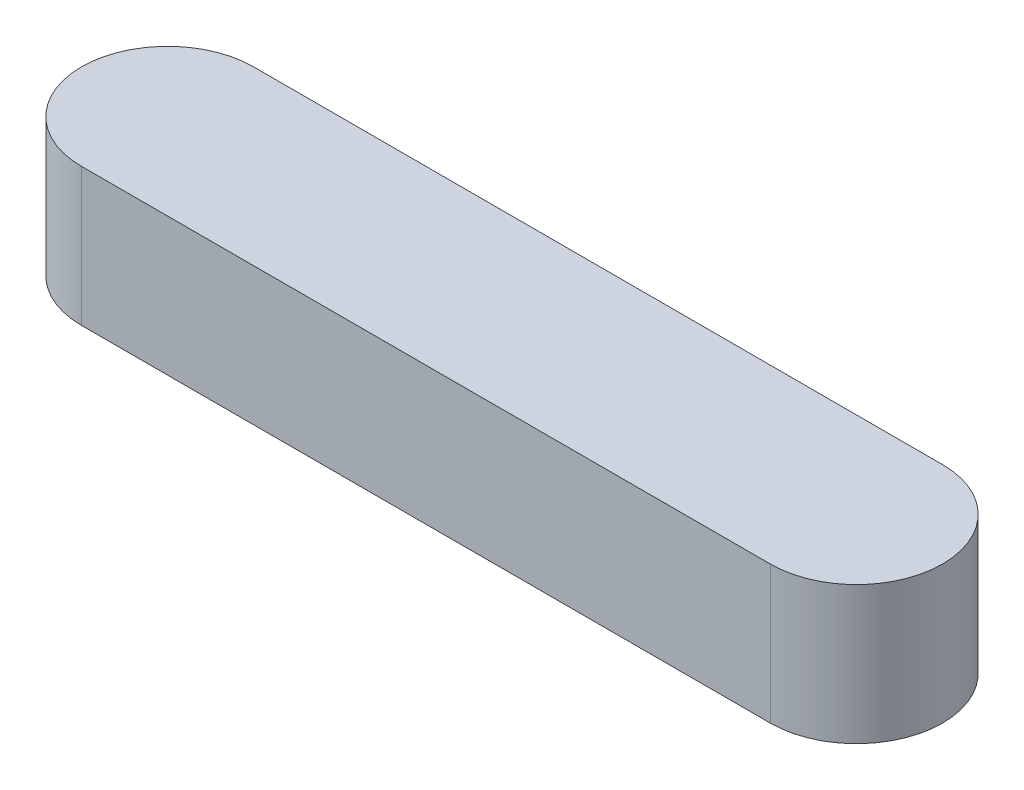
ISO-10303-21;
HEADER;
FILE_DESCRIPTION(('STEP AP214'),'2;1');
FILE_NAME('part.step','',(''),(''),'','','');
FILE_SCHEMA(('AUTOMOTIVE_DESIGN { 1 0 10303 214 1 1 1 1 }'));
ENDSEC;
DATA;
#1=APPLICATION_CONTEXT('core data for automotive mechanical design processes');
#2=APPLICATION_PROTOCOL_DEFINITION('international standard','automotive_design',2000,#1);
#3=PRODUCT_CONTEXT('',#1,'mechanical');
#4=PRODUCT('Part','Part','',(#3));
#5=PRODUCT_RELATED_PRODUCT_CATEGORY('part','',(#4));
#6=PRODUCT_DEFINITION_FORMATION('','',#4);
#7=PRODUCT_DEFINITION_CONTEXT('part definition',#1,'design');
#8=PRODUCT_DEFINITION('design','',#6,#7);
#9=PRODUCT_DEFINITION_SHAPE('','',#8);
#10=(LENGTH_UNIT() NAMED_UNIT(*) SI_UNIT(.MILLI.,.METRE.));
#11=(NAMED_UNIT(*) PLANE_ANGLE_UNIT() SI_UNIT($,.RADIAN.));
#12=(NAMED_UNIT(*) SI_UNIT($,.STERADIAN.) SOLID_ANGLE_UNIT());
#13=UNCERTAINTY_MEASURE_WITH_UNIT(LENGTH_MEASURE(1.E-05),#10,'distance_accuracy_value','');
#14=(GEOMETRIC_REPRESENTATION_CONTEXT(3) GLOBAL_UNCERTAINTY_ASSIGNED_CONTEXT((#13)) GLOBAL_UNIT_ASSIGNED_CONTEXT((#10,
#11,#12)) REPRESENTATION_CONTEXT('',''));
#15=CARTESIAN_POINT('',(0.,0.,0.));
#16=DIRECTION('',(0.,0.,1.));
#17=DIRECTION('',(1.,0.,0.));
#18=AXIS2_PLACEMENT_3D('',#15,#16,#17);
#19=CARTESIAN_POINT('',(-20.,8.,0.));
#20=DIRECTION('',(0.,-1.,0.));
#21=DIRECTION('',(0.,0.,-1.));
#22=AXIS2_PLACEMENT_3D('',#19,#20,#21);
#23=CYLINDRICAL_SURFACE('',#22,5.);
#24=CARTESIAN_POINT('',(-20.,0.,0.));
#25=DIRECTION('',(0.,1.,0.));
#26=DIRECTION('',(0.,0.,1.));
#27=AXIS2_PLACEMENT_3D('',#24,#25,#26);
#28=CIRCLE('',#27,5.);
#29=CARTESIAN_POINT('',(-20.,0.,-5.));
#30=VERTEX_POINT('',#29);
#31=CARTESIAN_POINT('',(-20.,0.,5.));
#32=VERTEX_POINT('',#31);
#33=EDGE_CURVE('E97',#30,#32,#28,.T.);
#34=ORIENTED_EDGE('',*,*,#33,.T.);
#35=DIRECTION('',(0.,-1.,0.));
#36=VECTOR('',#35,1.);
#37=CARTESIAN_POINT('',(-20.,8.,5.));
#38=LINE('',#37,#36);
#39=CARTESIAN_POINT('',(-20.,8.,5.));
#40=VERTEX_POINT('',#39);
#41=EDGE_CURVE('E11',#40,#32,#38,.T.);
#42=ORIENTED_EDGE('',*,*,#41,.F.);
#43=CARTESIAN_POINT('',(-20.,8.,0.));
#44=DIRECTION('',(0.,1.,0.));
#45=DIRECTION('',(0.,0.,1.));
#46=AXIS2_PLACEMENT_3D('',#43,#44,#45);
#47=CIRCLE('',#46,5.);
#48=CARTESIAN_POINT('',(-20.,8.,-5.));
#49=VERTEX_POINT('',#48);
#50=EDGE_CURVE('E85',#49,#40,#47,.T.);
#51=ORIENTED_EDGE('',*,*,#50,.F.);
#52=DIRECTION('',(0.,-1.,0.));
#53=VECTOR('',#52,1.);
#54=CARTESIAN_POINT('',(-20.,8.,-5.));
#55=LINE('',#54,#53);
#56=EDGE_CURVE('E93',#49,#30,#55,.T.);
#57=ORIENTED_EDGE('',*,*,#56,.T.);
#58=EDGE_LOOP('',(#34,#42,#51,#57));
#59=FACE_BOUND('',#58,.T.);
#60=ADVANCED_FACE('F34',(#59),#23,.T.);
#61=CARTESIAN_POINT('',(-20.,8.,5.));
#62=DIRECTION('',(0.,0.,-1.));
#63=DIRECTION('',(-1.,0.,0.));
#64=AXIS2_PLACEMENT_3D('',#61,#62,#63);
#65=PLANE('',#64);
#66=DIRECTION('',(1.,0.,0.));
#67=VECTOR('',#66,1.);
#68=CARTESIAN_POINT('',(-20.,0.,5.));
#69=LINE('',#68,#67);
#70=CARTESIAN_POINT('',(20.,0.,5.));
#71=VERTEX_POINT('',#70);
#72=EDGE_CURVE('E89',#32,#71,#69,.T.);
#73=ORIENTED_EDGE('',*,*,#72,.T.);
#74=DIRECTION('',(0.,-1.,0.));
#75=VECTOR('',#74,1.);
#76=CARTESIAN_POINT('',(20.,8.,5.));
#77=LINE('',#76,#75);
#78=CARTESIAN_POINT('',(20.,8.,5.));
#79=VERTEX_POINT('',#78);
#80=EDGE_CURVE('E42',#79,#71,#77,.T.);
#81=ORIENTED_EDGE('',*,*,#80,.F.);
#82=DIRECTION('',(1.,0.,0.));
#83=VECTOR('',#82,1.);
#84=CARTESIAN_POINT('',(-20.,8.,5.));
#85=LINE('',#84,#83);
#86=EDGE_CURVE('E80',#40,#79,#85,.T.);
#87=ORIENTED_EDGE('',*,*,#86,.F.);
#88=ORIENTED_EDGE('',*,*,#41,.T.);
#89=EDGE_LOOP('',(#73,#81,#87,#88));
#90=FACE_BOUND('',#89,.T.);
#91=ADVANCED_FACE('F88',(#90),#65,.F.);
#92=CARTESIAN_POINT('',(20.,8.,0.));
#93=DIRECTION('',(0.,-1.,0.));
#94=DIRECTION('',(0.,0.,-1.));
#95=AXIS2_PLACEMENT_3D('',#92,#93,#94);
#96=CYLINDRICAL_SURFACE('',#95,5.);
#97=CARTESIAN_POINT('',(20.,0.,0.));
#98=DIRECTION('',(0.,1.,0.));
#99=DIRECTION('',(0.,0.,1.));
#100=AXIS2_PLACEMENT_3D('',#97,#98,#99);
#101=CIRCLE('',#100,5.);
#102=CARTESIAN_POINT('',(20.,0.,-5.00000000000001));
#103=VERTEX_POINT('',#102);
#104=EDGE_CURVE('E67',#71,#103,#101,.T.);
#105=ORIENTED_EDGE('',*,*,#104,.T.);
#106=DIRECTION('',(0.,-1.,0.));
#107=VECTOR('',#106,1.);
#108=CARTESIAN_POINT('',(20.,8.,-5.00000000000001));
#109=LINE('',#108,#107);
#110=CARTESIAN_POINT('',(20.,8.,-5.00000000000001));
#111=VERTEX_POINT('',#110);
#112=EDGE_CURVE('E90',#111,#103,#109,.T.);
#113=ORIENTED_EDGE('',*,*,#112,.F.);
#114=CARTESIAN_POINT('',(20.,8.,0.));
#115=DIRECTION('',(0.,1.,0.));
#116=DIRECTION('',(0.,0.,1.));
#117=AXIS2_PLACEMENT_3D('',#114,#115,#116);
#118=CIRCLE('',#117,5.);
#119=EDGE_CURVE('E83',#79,#111,#118,.T.);
#120=ORIENTED_EDGE('',*,*,#119,.F.);
#121=ORIENTED_EDGE('',*,*,#80,.T.);
#122=EDGE_LOOP('',(#105,#113,#120,#121));
#123=FACE_BOUND('',#122,.T.);
#124=ADVANCED_FACE('F91',(#123),#96,.T.);
#125=CARTESIAN_POINT('',(-20.,8.,-5.));
#126=DIRECTION('',(0.,0.,1.));
#127=DIRECTION('',(1.,0.,0.));
#128=AXIS2_PLACEMENT_3D('',#125,#126,#127);
#129=PLANE('',#128);
#130=DIRECTION('',(-1.,0.,0.));
#131=VECTOR('',#130,1.);
#132=CARTESIAN_POINT('',(-20.,0.,-5.));
#133=LINE('',#132,#131);
#134=EDGE_CURVE('E73',#103,#30,#133,.T.);
#135=ORIENTED_EDGE('',*,*,#134,.T.);
#136=ORIENTED_EDGE('',*,*,#56,.F.);
#137=DIRECTION('',(-1.,0.,0.));
#138=VECTOR('',#137,1.);
#139=CARTESIAN_POINT('',(-20.,8.,-5.));
#140=LINE('',#139,#138);
#141=EDGE_CURVE('E50',#111,#49,#140,.T.);
#142=ORIENTED_EDGE('',*,*,#141,.F.);
#143=ORIENTED_EDGE('',*,*,#112,.T.);
#144=EDGE_LOOP('',(#135,#136,#142,#143));
#145=FACE_BOUND('',#144,.T.);
#146=ADVANCED_FACE('F104',(#145),#129,.F.);
#147=CARTESIAN_POINT('',(-20.,8.,0.));
#148=DIRECTION('',(0.,1.,0.));
#149=DIRECTION('',(0.,0.,1.));
#150=AXIS2_PLACEMENT_3D('',#147,#148,#149);
#151=PLANE('',#150);
#152=ORIENTED_EDGE('',*,*,#50,.T.);
#153=ORIENTED_EDGE('',*,*,#86,.T.);
#154=ORIENTED_EDGE('',*,*,#119,.T.);
#155=ORIENTED_EDGE('',*,*,#141,.T.);
#156=EDGE_LOOP('',(#152,#153,#154,#155));
#157=FACE_BOUND('',#156,.T.);
#158=ADVANCED_FACE('F81',(#157),#151,.T.);
#159=CARTESIAN_POINT('',(-20.,0.,0.));
#160=DIRECTION('',(0.,1.,0.));
#161=DIRECTION('',(0.,0.,1.));
#162=AXIS2_PLACEMENT_3D('',#159,#160,#161);
#163=PLANE('',#162);
#164=ORIENTED_EDGE('',*,*,#33,.F.);
#165=ORIENTED_EDGE('',*,*,#134,.F.);
#166=ORIENTED_EDGE('',*,*,#104,.F.);
#167=ORIENTED_EDGE('',*,*,#72,.F.);
#168=EDGE_LOOP('',(#164,#165,#166,#167));
#169=FACE_BOUND('',#168,.T.);
#170=ADVANCED_FACE('F107',(#169),#163,.F.);
#171=CLOSED_SHELL('',(#60,#91,#124,#146,#158,#170));
#172=MANIFOLD_SOLID_BREP('B2',#171);
#173=ADVANCED_BREP_SHAPE_REPRESENTATION('',(#18,#172),#14);
#174=SHAPE_DEFINITION_REPRESENTATION(#9,#173);
ENDSEC;
END-ISO-10303-21;
